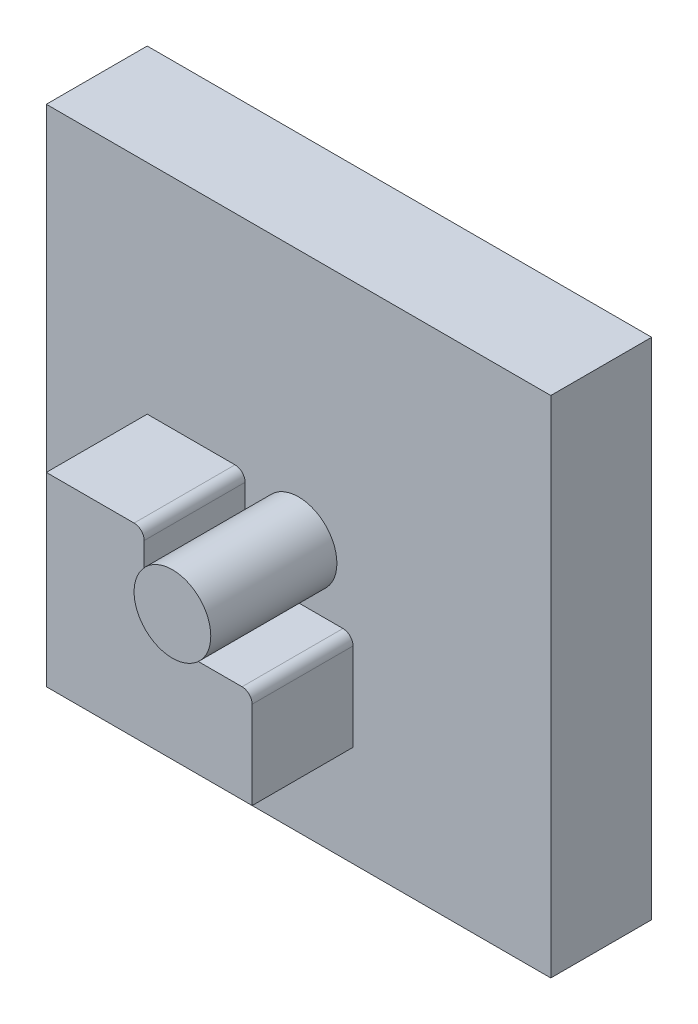
ISO-10303-21;
HEADER;
FILE_DESCRIPTION(('STEP AP214'),'2;1');
FILE_NAME('part.step','',(''),(''),'','','');
FILE_SCHEMA(('AUTOMOTIVE_DESIGN { 1 0 10303 214 1 1 1 1 }'));
ENDSEC;
DATA;
#1=APPLICATION_CONTEXT('core data for automotive mechanical design processes');
#2=APPLICATION_PROTOCOL_DEFINITION('international standard','automotive_design',2000,#1);
#3=PRODUCT_CONTEXT('',#1,'mechanical');
#4=PRODUCT('Part','Part','',(#3));
#5=PRODUCT_RELATED_PRODUCT_CATEGORY('part','',(#4));
#6=PRODUCT_DEFINITION_FORMATION('','',#4);
#7=PRODUCT_DEFINITION_CONTEXT('part definition',#1,'design');
#8=PRODUCT_DEFINITION('design','',#6,#7);
#9=PRODUCT_DEFINITION_SHAPE('','',#8);
#10=(LENGTH_UNIT() NAMED_UNIT(*) SI_UNIT(.MILLI.,.METRE.));
#11=(NAMED_UNIT(*) PLANE_ANGLE_UNIT() SI_UNIT($,.RADIAN.));
#12=(NAMED_UNIT(*) SI_UNIT($,.STERADIAN.) SOLID_ANGLE_UNIT());
#13=UNCERTAINTY_MEASURE_WITH_UNIT(LENGTH_MEASURE(1.E-05),#10,'distance_accuracy_value','');
#14=(GEOMETRIC_REPRESENTATION_CONTEXT(3) GLOBAL_UNCERTAINTY_ASSIGNED_CONTEXT((#13)) GLOBAL_UNIT_ASSIGNED_CONTEXT((#10,
#11,#12)) REPRESENTATION_CONTEXT('',''));
#15=CARTESIAN_POINT('',(0.,0.,0.));
#16=DIRECTION('',(0.,0.,1.));
#17=DIRECTION('',(1.,0.,0.));
#18=AXIS2_PLACEMENT_3D('',#15,#16,#17);
#19=CARTESIAN_POINT('',(-6.35,-6.35,2.54));
#20=DIRECTION('',(0.,0.,1.));
#21=DIRECTION('',(1.,0.,0.));
#22=AXIS2_PLACEMENT_3D('',#19,#20,#21);
#23=PLANE('',#22);
#24=CARTESIAN_POINT('',(0.,0.,2.54));
#25=DIRECTION('',(0.,0.,1.));
#26=DIRECTION('',(1.,0.,0.));
#27=AXIS2_PLACEMENT_3D('',#24,#25,#26);
#28=CIRCLE('',#27,0.9652);
#29=CARTESIAN_POINT('',(0.9652,0.,2.54));
#30=VERTEX_POINT('',#29);
#31=EDGE_CURVE('E477',#30,#30,#28,.T.);
#32=ORIENTED_EDGE('',*,*,#31,.F.);
#33=EDGE_LOOP('',(#32));
#34=FACE_BOUND('',#33,.T.);
#35=DIRECTION('',(0.,-1.,0.));
#36=VECTOR('',#35,1.);
#37=CARTESIAN_POINT('',(-6.35,6.35,2.54));
#38=LINE('',#37,#36);
#39=CARTESIAN_POINT('',(-6.35,6.35,2.54));
#40=VERTEX_POINT('',#39);
#41=CARTESIAN_POINT('',(-6.35,-6.35,2.54));
#42=VERTEX_POINT('',#41);
#43=EDGE_CURVE('E529',#40,#42,#38,.T.);
#44=ORIENTED_EDGE('',*,*,#43,.T.);
#45=DIRECTION('',(1.,0.,0.));
#46=VECTOR('',#45,1.);
#47=CARTESIAN_POINT('',(-6.35,-6.35,2.54));
#48=LINE('',#47,#46);
#49=CARTESIAN_POINT('',(6.35,-6.35,2.54));
#50=VERTEX_POINT('',#49);
#51=EDGE_CURVE('E532',#42,#50,#48,.T.);
#52=ORIENTED_EDGE('',*,*,#51,.T.);
#53=DIRECTION('',(0.,1.,0.));
#54=VECTOR('',#53,1.);
#55=CARTESIAN_POINT('',(6.35,6.35,2.54));
#56=LINE('',#55,#54);
#57=CARTESIAN_POINT('',(6.35,6.35,2.54));
#58=VERTEX_POINT('',#57);
#59=EDGE_CURVE('E534',#50,#58,#56,.T.);
#60=ORIENTED_EDGE('',*,*,#59,.T.);
#61=DIRECTION('',(-1.,0.,0.));
#62=VECTOR('',#61,1.);
#63=CARTESIAN_POINT('',(-6.35,6.35,2.54));
#64=LINE('',#63,#62);
#65=EDGE_CURVE('E536',#58,#40,#64,.T.);
#66=ORIENTED_EDGE('',*,*,#65,.T.);
#67=EDGE_LOOP('',(#44,#52,#60,#66));
#68=FACE_BOUND('',#67,.T.);
#69=DIRECTION('',(0.,1.,0.));
#70=VECTOR('',#69,1.);
#71=CARTESIAN_POINT('',(-1.3462,0.863600000000001,2.54));
#72=LINE('',#71,#70);
#73=CARTESIAN_POINT('',(-1.3462,-0.55245,2.54));
#74=VERTEX_POINT('',#73);
#75=CARTESIAN_POINT('',(-1.3462,0.609600000000001,2.54));
#76=VERTEX_POINT('',#75);
#77=EDGE_CURVE('E495',#74,#76,#72,.T.);
#78=ORIENTED_EDGE('',*,*,#77,.F.);
#79=CARTESIAN_POINT('',(-0.55245,-0.55245,2.54));
#80=DIRECTION('',(0.,0.,1.));
#81=DIRECTION('',(1.,0.,0.));
#82=AXIS2_PLACEMENT_3D('',#79,#80,#81);
#83=CIRCLE('',#82,0.79375);
#84=CARTESIAN_POINT('',(-0.55245,-1.3462,2.54));
#85=VERTEX_POINT('',#84);
#86=EDGE_CURVE('E553',#74,#85,#83,.T.);
#87=ORIENTED_EDGE('',*,*,#86,.T.);
#88=DIRECTION('',(-1.,0.,0.));
#89=VECTOR('',#88,1.);
#90=CARTESIAN_POINT('',(-1.3462,-1.3462,2.54));
#91=LINE('',#90,#89);
#92=CARTESIAN_POINT('',(1.1176,-1.3462,2.54));
#93=VERTEX_POINT('',#92);
#94=EDGE_CURVE('E491',#93,#85,#91,.T.);
#95=ORIENTED_EDGE('',*,*,#94,.F.);
#96=CARTESIAN_POINT('',(1.1176,-1.6002,2.54));
#97=DIRECTION('',(0.,0.,1.));
#98=DIRECTION('',(1.,0.,0.));
#99=AXIS2_PLACEMENT_3D('',#96,#97,#98);
#100=CIRCLE('',#99,0.254);
#101=CARTESIAN_POINT('',(1.3716,-1.6002,2.54));
#102=VERTEX_POINT('',#101);
#103=EDGE_CURVE('E11',#93,#102,#100,.F.);
#104=ORIENTED_EDGE('',*,*,#103,.T.);
#105=DIRECTION('',(0.,1.,0.));
#106=VECTOR('',#105,1.);
#107=CARTESIAN_POINT('',(1.3716,-1.3462,2.54));
#108=LINE('',#107,#106);
#109=CARTESIAN_POINT('',(1.3716,-3.81,2.54));
#110=VERTEX_POINT('',#109);
#111=EDGE_CURVE('E489',#110,#102,#108,.T.);
#112=ORIENTED_EDGE('',*,*,#111,.F.);
#113=DIRECTION('',(1.,0.,0.));
#114=VECTOR('',#113,1.);
#115=CARTESIAN_POINT('',(1.3716,-3.81,2.54));
#116=LINE('',#115,#114);
#117=CARTESIAN_POINT('',(-3.81,-3.81,2.54));
#118=VERTEX_POINT('',#117);
#119=EDGE_CURVE('E471',#118,#110,#116,.T.);
#120=ORIENTED_EDGE('',*,*,#119,.F.);
#121=DIRECTION('',(0.,-1.,0.));
#122=VECTOR('',#121,1.);
#123=CARTESIAN_POINT('',(-3.81,0.863600000000001,2.54));
#124=LINE('',#123,#122);
#125=CARTESIAN_POINT('',(-3.81,0.863600000000001,2.54));
#126=VERTEX_POINT('',#125);
#127=EDGE_CURVE('E482',#126,#118,#124,.T.);
#128=ORIENTED_EDGE('',*,*,#127,.F.);
#129=DIRECTION('',(-1.,0.,0.));
#130=VECTOR('',#129,1.);
#131=CARTESIAN_POINT('',(-3.81,0.863600000000001,2.54));
#132=LINE('',#131,#130);
#133=CARTESIAN_POINT('',(-1.6002,0.863600000000001,2.54));
#134=VERTEX_POINT('',#133);
#135=EDGE_CURVE('E498',#134,#126,#132,.T.);
#136=ORIENTED_EDGE('',*,*,#135,.F.);
#137=CARTESIAN_POINT('',(-1.6002,0.609600000000001,2.54));
#138=DIRECTION('',(0.,0.,1.));
#139=DIRECTION('',(1.,0.,0.));
#140=AXIS2_PLACEMENT_3D('',#137,#138,#139);
#141=CIRCLE('',#140,0.254);
#142=EDGE_CURVE('E381',#134,#76,#141,.F.);
#143=ORIENTED_EDGE('',*,*,#142,.T.);
#144=EDGE_LOOP('',(#78,#87,#95,#104,#112,#120,#128,#136,#143));
#145=FACE_BOUND('',#144,.T.);
#146=ADVANCED_FACE('F373',(#34,#68,#145),#23,.T.);
#147=CARTESIAN_POINT('',(-6.35,6.35,2.54));
#148=DIRECTION('',(1.,0.,0.));
#149=DIRECTION('',(0.,1.,0.));
#150=AXIS2_PLACEMENT_3D('',#147,#148,#149);
#151=PLANE('',#150);
#152=DIRECTION('',(0.,-1.,0.));
#153=VECTOR('',#152,1.);
#154=CARTESIAN_POINT('',(-6.35,6.35,0.));
#155=LINE('',#154,#153);
#156=CARTESIAN_POINT('',(-6.35,6.35,0.));
#157=VERTEX_POINT('',#156);
#158=CARTESIAN_POINT('',(-6.35,-6.35,0.));
#159=VERTEX_POINT('',#158);
#160=EDGE_CURVE('E520',#157,#159,#155,.T.);
#161=ORIENTED_EDGE('',*,*,#160,.T.);
#162=DIRECTION('',(0.,0.,-1.));
#163=VECTOR('',#162,1.);
#164=CARTESIAN_POINT('',(-6.35,-6.35,2.54));
#165=LINE('',#164,#163);
#166=EDGE_CURVE('E547',#42,#159,#165,.T.);
#167=ORIENTED_EDGE('',*,*,#166,.F.);
#168=ORIENTED_EDGE('',*,*,#43,.F.);
#169=DIRECTION('',(0.,0.,-1.));
#170=VECTOR('',#169,1.);
#171=CARTESIAN_POINT('',(-6.35,6.35,2.54));
#172=LINE('',#171,#170);
#173=EDGE_CURVE('E538',#40,#157,#172,.T.);
#174=ORIENTED_EDGE('',*,*,#173,.T.);
#175=EDGE_LOOP('',(#161,#167,#168,#174));
#176=FACE_BOUND('',#175,.T.);
#177=ADVANCED_FACE('F375',(#176),#151,.F.);
#178=CARTESIAN_POINT('',(-6.35,-6.35,2.54));
#179=DIRECTION('',(0.,1.,0.));
#180=DIRECTION('',(0.,0.,1.));
#181=AXIS2_PLACEMENT_3D('',#178,#179,#180);
#182=PLANE('',#181);
#183=DIRECTION('',(1.,0.,0.));
#184=VECTOR('',#183,1.);
#185=CARTESIAN_POINT('',(-6.35,-6.35,0.));
#186=LINE('',#185,#184);
#187=CARTESIAN_POINT('',(6.35,-6.35,0.));
#188=VERTEX_POINT('',#187);
#189=EDGE_CURVE('E523',#159,#188,#186,.T.);
#190=ORIENTED_EDGE('',*,*,#189,.T.);
#191=DIRECTION('',(0.,0.,-1.));
#192=VECTOR('',#191,1.);
#193=CARTESIAN_POINT('',(6.35,-6.35,2.54));
#194=LINE('',#193,#192);
#195=EDGE_CURVE('E544',#50,#188,#194,.T.);
#196=ORIENTED_EDGE('',*,*,#195,.F.);
#197=ORIENTED_EDGE('',*,*,#51,.F.);
#198=ORIENTED_EDGE('',*,*,#166,.T.);
#199=EDGE_LOOP('',(#190,#196,#197,#198));
#200=FACE_BOUND('',#199,.T.);
#201=ADVANCED_FACE('F615',(#200),#182,.F.);
#202=CARTESIAN_POINT('',(6.35,6.35,2.54));
#203=DIRECTION('',(-1.,0.,0.));
#204=DIRECTION('',(0.,-1.,0.));
#205=AXIS2_PLACEMENT_3D('',#202,#203,#204);
#206=PLANE('',#205);
#207=DIRECTION('',(0.,1.,0.));
#208=VECTOR('',#207,1.);
#209=CARTESIAN_POINT('',(6.35,6.35,0.));
#210=LINE('',#209,#208);
#211=CARTESIAN_POINT('',(6.35,6.35,0.));
#212=VERTEX_POINT('',#211);
#213=EDGE_CURVE('E525',#188,#212,#210,.T.);
#214=ORIENTED_EDGE('',*,*,#213,.T.);
#215=DIRECTION('',(0.,0.,-1.));
#216=VECTOR('',#215,1.);
#217=CARTESIAN_POINT('',(6.35,6.35,2.54));
#218=LINE('',#217,#216);
#219=EDGE_CURVE('E541',#58,#212,#218,.T.);
#220=ORIENTED_EDGE('',*,*,#219,.F.);
#221=ORIENTED_EDGE('',*,*,#59,.F.);
#222=ORIENTED_EDGE('',*,*,#195,.T.);
#223=EDGE_LOOP('',(#214,#220,#221,#222));
#224=FACE_BOUND('',#223,.T.);
#225=ADVANCED_FACE('F626',(#224),#206,.F.);
#226=CARTESIAN_POINT('',(-6.35,6.35,2.54));
#227=DIRECTION('',(0.,-1.,0.));
#228=DIRECTION('',(0.,0.,-1.));
#229=AXIS2_PLACEMENT_3D('',#226,#227,#228);
#230=PLANE('',#229);
#231=DIRECTION('',(-1.,0.,0.));
#232=VECTOR('',#231,1.);
#233=CARTESIAN_POINT('',(-6.35,6.35,0.));
#234=LINE('',#233,#232);
#235=EDGE_CURVE('E527',#212,#157,#234,.T.);
#236=ORIENTED_EDGE('',*,*,#235,.T.);
#237=ORIENTED_EDGE('',*,*,#173,.F.);
#238=ORIENTED_EDGE('',*,*,#65,.F.);
#239=ORIENTED_EDGE('',*,*,#219,.T.);
#240=EDGE_LOOP('',(#236,#237,#238,#239));
#241=FACE_BOUND('',#240,.T.);
#242=ADVANCED_FACE('F623',(#241),#230,.F.);
#243=CARTESIAN_POINT('',(-6.35,-6.35,0.));
#244=DIRECTION('',(0.,0.,1.));
#245=DIRECTION('',(1.,0.,0.));
#246=AXIS2_PLACEMENT_3D('',#243,#244,#245);
#247=PLANE('',#246);
#248=ORIENTED_EDGE('',*,*,#160,.F.);
#249=ORIENTED_EDGE('',*,*,#235,.F.);
#250=ORIENTED_EDGE('',*,*,#213,.F.);
#251=ORIENTED_EDGE('',*,*,#189,.F.);
#252=EDGE_LOOP('',(#248,#249,#250,#251));
#253=FACE_BOUND('',#252,.T.);
#254=ADVANCED_FACE('F621',(#253),#247,.F.);
#255=CARTESIAN_POINT('',(0.,0.,5.715));
#256=DIRECTION('',(0.,0.,-1.));
#257=DIRECTION('',(-1.,0.,0.));
#258=AXIS2_PLACEMENT_3D('',#255,#256,#257);
#259=CYLINDRICAL_SURFACE('',#258,0.9652);
#260=CARTESIAN_POINT('',(0.,0.,5.715));
#261=DIRECTION('',(0.,0.,1.));
#262=DIRECTION('',(1.,0.,0.));
#263=AXIS2_PLACEMENT_3D('',#260,#261,#262);
#264=CIRCLE('',#263,0.9652);
#265=CARTESIAN_POINT('',(0.9652,0.,5.715));
#266=VERTEX_POINT('',#265);
#267=EDGE_CURVE('E517',#266,#266,#264,.T.);
#268=ORIENTED_EDGE('',*,*,#267,.F.);
#269=EDGE_LOOP('',(#268));
#270=FACE_BOUND('',#269,.T.);
#271=ORIENTED_EDGE('',*,*,#31,.T.);
#272=EDGE_LOOP('',(#271));
#273=FACE_BOUND('',#272,.T.);
#274=ADVANCED_FACE('F646',(#270,#273),#259,.T.);
#275=CARTESIAN_POINT('',(0.,0.,5.715));
#276=DIRECTION('',(0.,0.,1.));
#277=DIRECTION('',(1.,0.,0.));
#278=AXIS2_PLACEMENT_3D('',#275,#276,#277);
#279=PLANE('',#278);
#280=ORIENTED_EDGE('',*,*,#267,.T.);
#281=EDGE_LOOP('',(#280));
#282=FACE_BOUND('',#281,.T.);
#283=ADVANCED_FACE('F650',(#282),#279,.T.);
#284=CARTESIAN_POINT('',(-3.81,0.863600000000001,5.08));
#285=DIRECTION('',(1.,0.,0.));
#286=DIRECTION('',(0.,1.,0.));
#287=AXIS2_PLACEMENT_3D('',#284,#285,#286);
#288=PLANE('',#287);
#289=ORIENTED_EDGE('',*,*,#127,.T.);
#290=DIRECTION('',(0.,0.,-1.));
#291=VECTOR('',#290,1.);
#292=CARTESIAN_POINT('',(-3.81,-3.81,5.08));
#293=LINE('',#292,#291);
#294=CARTESIAN_POINT('',(-3.81,-3.81,5.08));
#295=VERTEX_POINT('',#294);
#296=EDGE_CURVE('E466',#295,#118,#293,.T.);
#297=ORIENTED_EDGE('',*,*,#296,.F.);
#298=DIRECTION('',(0.,-1.,0.));
#299=VECTOR('',#298,1.);
#300=CARTESIAN_POINT('',(-3.81,0.863600000000001,5.08));
#301=LINE('',#300,#299);
#302=CARTESIAN_POINT('',(-3.81,0.863600000000001,5.08));
#303=VERTEX_POINT('',#302);
#304=EDGE_CURVE('E500',#303,#295,#301,.T.);
#305=ORIENTED_EDGE('',*,*,#304,.F.);
#306=DIRECTION('',(0.,0.,-1.));
#307=VECTOR('',#306,1.);
#308=CARTESIAN_POINT('',(-3.81,0.863600000000001,5.08));
#309=LINE('',#308,#307);
#310=EDGE_CURVE('E485',#303,#126,#309,.T.);
#311=ORIENTED_EDGE('',*,*,#310,.T.);
#312=EDGE_LOOP('',(#289,#297,#305,#311));
#313=FACE_BOUND('',#312,.T.);
#314=ADVANCED_FACE('F483',(#313),#288,.F.);
#315=CARTESIAN_POINT('',(1.3716,-3.81,5.08));
#316=DIRECTION('',(0.,1.,0.));
#317=DIRECTION('',(0.,0.,1.));
#318=AXIS2_PLACEMENT_3D('',#315,#316,#317);
#319=PLANE('',#318);
#320=ORIENTED_EDGE('',*,*,#119,.T.);
#321=DIRECTION('',(0.,0.,-1.));
#322=VECTOR('',#321,1.);
#323=CARTESIAN_POINT('',(1.3716,-3.81,5.08));
#324=LINE('',#323,#322);
#325=CARTESIAN_POINT('',(1.3716,-3.81,5.08));
#326=VERTEX_POINT('',#325);
#327=EDGE_CURVE('E478',#326,#110,#324,.T.);
#328=ORIENTED_EDGE('',*,*,#327,.F.);
#329=DIRECTION('',(1.,0.,0.));
#330=VECTOR('',#329,1.);
#331=CARTESIAN_POINT('',(1.3716,-3.81,5.08));
#332=LINE('',#331,#330);
#333=EDGE_CURVE('E473',#295,#326,#332,.T.);
#334=ORIENTED_EDGE('',*,*,#333,.F.);
#335=ORIENTED_EDGE('',*,*,#296,.T.);
#336=EDGE_LOOP('',(#320,#328,#334,#335));
#337=FACE_BOUND('',#336,.T.);
#338=ADVANCED_FACE('F468',(#337),#319,.F.);
#339=CARTESIAN_POINT('',(1.3716,-1.3462,5.08));
#340=DIRECTION('',(-1.,0.,0.));
#341=DIRECTION('',(0.,0.,1.));
#342=AXIS2_PLACEMENT_3D('',#339,#340,#341);
#343=PLANE('',#342);
#344=ORIENTED_EDGE('',*,*,#111,.T.);
#345=DIRECTION('',(0.,0.,-1.));
#346=VECTOR('',#345,1.);
#347=CARTESIAN_POINT('',(1.3716,-1.6002,5.08));
#348=LINE('',#347,#346);
#349=CARTESIAN_POINT('',(1.3716,-1.6002,5.08));
#350=VERTEX_POINT('',#349);
#351=EDGE_CURVE('E572',#102,#350,#348,.F.);
#352=ORIENTED_EDGE('',*,*,#351,.T.);
#353=DIRECTION('',(0.,1.,0.));
#354=VECTOR('',#353,1.);
#355=CARTESIAN_POINT('',(1.3716,-1.3462,5.08));
#356=LINE('',#355,#354);
#357=EDGE_CURVE('E503',#326,#350,#356,.T.);
#358=ORIENTED_EDGE('',*,*,#357,.F.);
#359=ORIENTED_EDGE('',*,*,#327,.T.);
#360=EDGE_LOOP('',(#344,#352,#358,#359));
#361=FACE_BOUND('',#360,.T.);
#362=ADVANCED_FACE('F590',(#361),#343,.F.);
#363=CARTESIAN_POINT('',(-1.3462,-1.3462,5.08));
#364=DIRECTION('',(0.,-1.,0.));
#365=DIRECTION('',(0.,0.,-1.));
#366=AXIS2_PLACEMENT_3D('',#363,#364,#365);
#367=PLANE('',#366);
#368=DIRECTION('',(-1.,0.,0.));
#369=VECTOR('',#368,1.);
#370=CARTESIAN_POINT('',(-1.3462,-1.3462,5.08));
#371=LINE('',#370,#369);
#372=CARTESIAN_POINT('',(1.1176,-1.3462,5.08));
#373=VERTEX_POINT('',#372);
#374=CARTESIAN_POINT('',(-0.55245,-1.3462,5.08));
#375=VERTEX_POINT('',#374);
#376=EDGE_CURVE('E506',#373,#375,#371,.T.);
#377=ORIENTED_EDGE('',*,*,#376,.F.);
#378=DIRECTION('',(0.,0.,-1.));
#379=VECTOR('',#378,1.);
#380=CARTESIAN_POINT('',(1.1176,-1.3462,5.08));
#381=LINE('',#380,#379);
#382=EDGE_CURVE('E570',#373,#93,#381,.T.);
#383=ORIENTED_EDGE('',*,*,#382,.T.);
#384=ORIENTED_EDGE('',*,*,#94,.T.);
#385=DIRECTION('',(0.,0.,-1.));
#386=VECTOR('',#385,1.);
#387=CARTESIAN_POINT('',(-0.55245,-1.3462,5.08));
#388=LINE('',#387,#386);
#389=EDGE_CURVE('E556',#85,#375,#388,.F.);
#390=ORIENTED_EDGE('',*,*,#389,.T.);
#391=EDGE_LOOP('',(#377,#383,#384,#390));
#392=FACE_BOUND('',#391,.T.);
#393=ADVANCED_FACE('F594',(#392),#367,.F.);
#394=CARTESIAN_POINT('',(-1.3462,0.863600000000001,5.08));
#395=DIRECTION('',(-1.,0.,0.));
#396=DIRECTION('',(0.,0.,1.));
#397=AXIS2_PLACEMENT_3D('',#394,#395,#396);
#398=PLANE('',#397);
#399=ORIENTED_EDGE('',*,*,#77,.T.);
#400=DIRECTION('',(0.,0.,-1.));
#401=VECTOR('',#400,1.);
#402=CARTESIAN_POINT('',(-1.3462,0.609600000000001,5.08));
#403=LINE('',#402,#401);
#404=CARTESIAN_POINT('',(-1.3462,0.609600000000001,5.08));
#405=VERTEX_POINT('',#404);
#406=EDGE_CURVE('E564',#76,#405,#403,.F.);
#407=ORIENTED_EDGE('',*,*,#406,.T.);
#408=DIRECTION('',(0.,1.,0.));
#409=VECTOR('',#408,1.);
#410=CARTESIAN_POINT('',(-1.3462,0.863600000000001,5.08));
#411=LINE('',#410,#409);
#412=CARTESIAN_POINT('',(-1.3462,-0.55245,5.08));
#413=VERTEX_POINT('',#412);
#414=EDGE_CURVE('E508',#413,#405,#411,.T.);
#415=ORIENTED_EDGE('',*,*,#414,.F.);
#416=DIRECTION('',(0.,0.,-1.));
#417=VECTOR('',#416,1.);
#418=CARTESIAN_POINT('',(-1.3462,-0.55245,2.54));
#419=LINE('',#418,#417);
#420=EDGE_CURVE('E550',#413,#74,#419,.T.);
#421=ORIENTED_EDGE('',*,*,#420,.T.);
#422=EDGE_LOOP('',(#399,#407,#415,#421));
#423=FACE_BOUND('',#422,.T.);
#424=ADVANCED_FACE('F577',(#423),#398,.F.);
#425=CARTESIAN_POINT('',(-3.81,0.863600000000001,5.08));
#426=DIRECTION('',(0.,-1.,0.));
#427=DIRECTION('',(0.,0.,-1.));
#428=AXIS2_PLACEMENT_3D('',#425,#426,#427);
#429=PLANE('',#428);
#430=DIRECTION('',(-1.,0.,0.));
#431=VECTOR('',#430,1.);
#432=CARTESIAN_POINT('',(-3.81,0.863600000000001,5.08));
#433=LINE('',#432,#431);
#434=CARTESIAN_POINT('',(-1.6002,0.863600000000001,5.08));
#435=VERTEX_POINT('',#434);
#436=EDGE_CURVE('E511',#435,#303,#433,.T.);
#437=ORIENTED_EDGE('',*,*,#436,.F.);
#438=DIRECTION('',(0.,0.,-1.));
#439=VECTOR('',#438,1.);
#440=CARTESIAN_POINT('',(-1.6002,0.863600000000001,5.08));
#441=LINE('',#440,#439);
#442=EDGE_CURVE('E561',#435,#134,#441,.T.);
#443=ORIENTED_EDGE('',*,*,#442,.T.);
#444=ORIENTED_EDGE('',*,*,#135,.T.);
#445=ORIENTED_EDGE('',*,*,#310,.F.);
#446=EDGE_LOOP('',(#437,#443,#444,#445));
#447=FACE_BOUND('',#446,.T.);
#448=ADVANCED_FACE('F586',(#447),#429,.F.);
#449=CARTESIAN_POINT('',(-3.81,-3.81,5.08));
#450=DIRECTION('',(0.,0.,-1.));
#451=DIRECTION('',(-1.,0.,0.));
#452=AXIS2_PLACEMENT_3D('',#449,#450,#451);
#453=PLANE('',#452);
#454=ORIENTED_EDGE('',*,*,#414,.T.);
#455=CARTESIAN_POINT('',(-1.6002,0.609600000000001,5.08));
#456=DIRECTION('',(0.,0.,-1.));
#457=DIRECTION('',(-1.,0.,0.));
#458=AXIS2_PLACEMENT_3D('',#455,#456,#457);
#459=CIRCLE('',#458,0.254);
#460=EDGE_CURVE('E568',#405,#435,#459,.F.);
#461=ORIENTED_EDGE('',*,*,#460,.T.);
#462=ORIENTED_EDGE('',*,*,#436,.T.);
#463=ORIENTED_EDGE('',*,*,#304,.T.);
#464=ORIENTED_EDGE('',*,*,#333,.T.);
#465=ORIENTED_EDGE('',*,*,#357,.T.);
#466=CARTESIAN_POINT('',(1.1176,-1.6002,5.08));
#467=DIRECTION('',(0.,0.,-1.));
#468=DIRECTION('',(-1.,0.,0.));
#469=AXIS2_PLACEMENT_3D('',#466,#467,#468);
#470=CIRCLE('',#469,0.254);
#471=EDGE_CURVE('E566',#350,#373,#470,.F.);
#472=ORIENTED_EDGE('',*,*,#471,.T.);
#473=ORIENTED_EDGE('',*,*,#376,.T.);
#474=CARTESIAN_POINT('',(-0.55245,-0.55245,5.08));
#475=DIRECTION('',(0.,0.,-1.));
#476=DIRECTION('',(-1.,0.,0.));
#477=AXIS2_PLACEMENT_3D('',#474,#475,#476);
#478=CIRCLE('',#477,0.79375);
#479=EDGE_CURVE('E559',#375,#413,#478,.T.);
#480=ORIENTED_EDGE('',*,*,#479,.T.);
#481=EDGE_LOOP('',(#454,#461,#462,#463,#464,#465,#472,#473,#480));
#482=FACE_BOUND('',#481,.T.);
#483=ADVANCED_FACE('F584',(#482),#453,.F.);
#484=CARTESIAN_POINT('',(-0.55245,-0.55245,5.08));
#485=DIRECTION('',(0.,0.,1.));
#486=DIRECTION('',(1.,0.,0.));
#487=AXIS2_PLACEMENT_3D('',#484,#485,#486);
#488=CYLINDRICAL_SURFACE('',#487,0.79375);
#489=ORIENTED_EDGE('',*,*,#479,.F.);
#490=ORIENTED_EDGE('',*,*,#389,.F.);
#491=ORIENTED_EDGE('',*,*,#86,.F.);
#492=ORIENTED_EDGE('',*,*,#420,.F.);
#493=EDGE_LOOP('',(#489,#490,#491,#492));
#494=FACE_BOUND('',#493,.T.);
#495=ADVANCED_FACE('F598',(#494),#488,.F.);
#496=CARTESIAN_POINT('',(-1.6002,0.609600000000001,5.08));
#497=DIRECTION('',(0.,0.,-1.));
#498=DIRECTION('',(-1.,0.,0.));
#499=AXIS2_PLACEMENT_3D('',#496,#497,#498);
#500=CYLINDRICAL_SURFACE('',#499,0.254);
#501=ORIENTED_EDGE('',*,*,#460,.F.);
#502=ORIENTED_EDGE('',*,*,#406,.F.);
#503=ORIENTED_EDGE('',*,*,#142,.F.);
#504=ORIENTED_EDGE('',*,*,#442,.F.);
#505=EDGE_LOOP('',(#501,#502,#503,#504));
#506=FACE_BOUND('',#505,.T.);
#507=ADVANCED_FACE('F581',(#506),#500,.T.);
#508=CARTESIAN_POINT('',(1.1176,-1.6002,5.08));
#509=DIRECTION('',(0.,0.,-1.));
#510=DIRECTION('',(-1.,0.,0.));
#511=AXIS2_PLACEMENT_3D('',#508,#509,#510);
#512=CYLINDRICAL_SURFACE('',#511,0.254);
#513=ORIENTED_EDGE('',*,*,#471,.F.);
#514=ORIENTED_EDGE('',*,*,#351,.F.);
#515=ORIENTED_EDGE('',*,*,#103,.F.);
#516=ORIENTED_EDGE('',*,*,#382,.F.);
#517=EDGE_LOOP('',(#513,#514,#515,#516));
#518=FACE_BOUND('',#517,.T.);
#519=ADVANCED_FACE('F591',(#518),#512,.T.);
#520=CLOSED_SHELL('',(#146,#177,#201,#225,#242,#254,#274,#283,#314,#338,#362,#393,#424,#448,
#483,#495,#507,#519));
#521=MANIFOLD_SOLID_BREP('B2',#520);
#522=ADVANCED_BREP_SHAPE_REPRESENTATION('',(#18,#521),#14);
#523=SHAPE_DEFINITION_REPRESENTATION(#9,#522);
ENDSEC;
END-ISO-10303-21;
